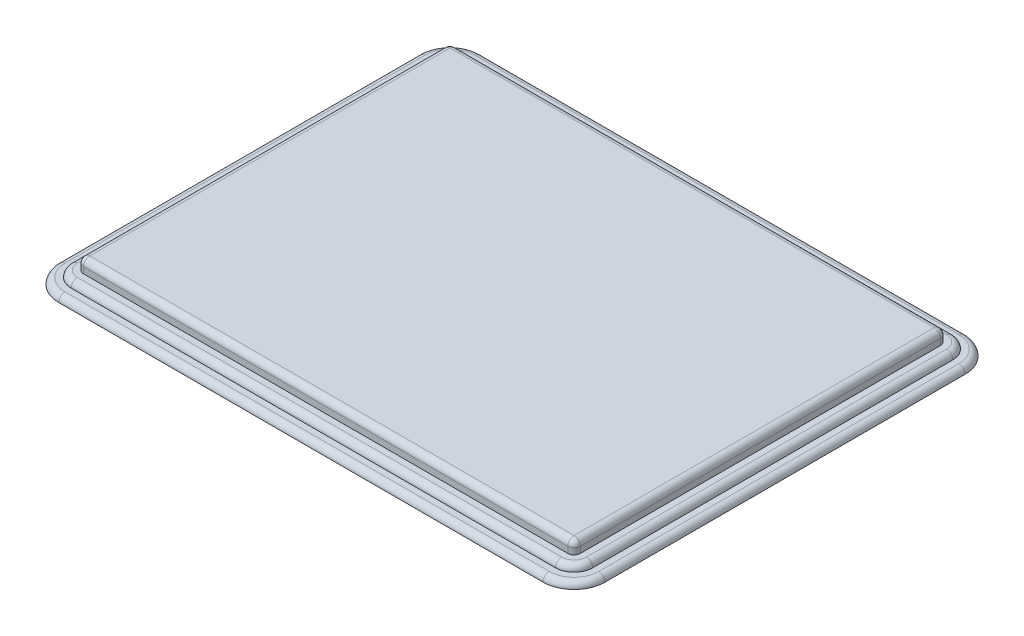
ISO-10303-21;
HEADER;
FILE_DESCRIPTION(('STEP AP214'),'2;1');
FILE_NAME('part.step','',(''),(''),'','','');
FILE_SCHEMA(('AUTOMOTIVE_DESIGN { 1 0 10303 214 1 1 1 1 }'));
ENDSEC;
DATA;
#1=APPLICATION_CONTEXT('core data for automotive mechanical design processes');
#2=APPLICATION_PROTOCOL_DEFINITION('international standard','automotive_design',2000,#1);
#3=PRODUCT_CONTEXT('',#1,'mechanical');
#4=PRODUCT('Part','Part','',(#3));
#5=PRODUCT_RELATED_PRODUCT_CATEGORY('part','',(#4));
#6=PRODUCT_DEFINITION_FORMATION('','',#4);
#7=PRODUCT_DEFINITION_CONTEXT('part definition',#1,'design');
#8=PRODUCT_DEFINITION('design','',#6,#7);
#9=PRODUCT_DEFINITION_SHAPE('','',#8);
#10=(LENGTH_UNIT() NAMED_UNIT(*) SI_UNIT(.MILLI.,.METRE.));
#11=(NAMED_UNIT(*) PLANE_ANGLE_UNIT() SI_UNIT($,.RADIAN.));
#12=(NAMED_UNIT(*) SI_UNIT($,.STERADIAN.) SOLID_ANGLE_UNIT());
#13=UNCERTAINTY_MEASURE_WITH_UNIT(LENGTH_MEASURE(1.E-05),#10,'distance_accuracy_value','');
#14=(GEOMETRIC_REPRESENTATION_CONTEXT(3) GLOBAL_UNCERTAINTY_ASSIGNED_CONTEXT((#13)) GLOBAL_UNIT_ASSIGNED_CONTEXT((#10,
#11,#12)) REPRESENTATION_CONTEXT('',''));
#15=CARTESIAN_POINT('',(0.,0.,0.));
#16=DIRECTION('',(0.,0.,1.));
#17=DIRECTION('',(1.,0.,0.));
#18=AXIS2_PLACEMENT_3D('',#15,#16,#17);
#19=CARTESIAN_POINT('',(1950.,100.,-1450.));
#20=DIRECTION('',(0.,-1.,0.));
#21=DIRECTION('',(0.,0.,-1.));
#22=AXIS2_PLACEMENT_3D('',#19,#20,#21);
#23=CYLINDRICAL_SURFACE('',#22,50.);
#24=DIRECTION('',(0.,-1.,0.));
#25=VECTOR('',#24,1.);
#26=CARTESIAN_POINT('',(1950.,100.,-1500.));
#27=LINE('',#26,#25);
#28=CARTESIAN_POINT('',(1950.,50.,-1500.));
#29=VERTEX_POINT('',#28);
#30=CARTESIAN_POINT('',(1950.,0.,-1500.));
#31=VERTEX_POINT('',#30);
#32=EDGE_CURVE('E454',#29,#31,#27,.T.);
#33=ORIENTED_EDGE('',*,*,#32,.F.);
#34=CARTESIAN_POINT('',(1950.,50.,-1450.));
#35=DIRECTION('',(0.,-1.,0.));
#36=DIRECTION('',(0.,0.,-1.));
#37=AXIS2_PLACEMENT_3D('',#34,#35,#36);
#38=CIRCLE('',#37,50.);
#39=CARTESIAN_POINT('',(2000.,50.,-1450.));
#40=VERTEX_POINT('',#39);
#41=EDGE_CURVE('E322',#29,#40,#38,.T.);
#42=ORIENTED_EDGE('',*,*,#41,.T.);
#43=DIRECTION('',(0.,-1.,0.));
#44=VECTOR('',#43,1.);
#45=CARTESIAN_POINT('',(2000.,100.,-1450.));
#46=LINE('',#45,#44);
#47=CARTESIAN_POINT('',(2000.,0.,-1450.));
#48=VERTEX_POINT('',#47);
#49=EDGE_CURVE('E426',#40,#48,#46,.T.);
#50=ORIENTED_EDGE('',*,*,#49,.T.);
#51=CARTESIAN_POINT('',(1950.,0.,-1450.));
#52=DIRECTION('',(0.,1.,0.));
#53=DIRECTION('',(0.,0.,-1.));
#54=AXIS2_PLACEMENT_3D('',#51,#52,#53);
#55=CIRCLE('',#54,50.);
#56=EDGE_CURVE('E393',#48,#31,#55,.T.);
#57=ORIENTED_EDGE('',*,*,#56,.T.);
#58=EDGE_LOOP('',(#33,#42,#50,#57));
#59=FACE_BOUND('',#58,.T.);
#60=ADVANCED_FACE('F41',(#59),#23,.T.);
#61=CARTESIAN_POINT('',(-1950.,100.,-1500.));
#62=DIRECTION('',(0.,0.,1.));
#63=DIRECTION('',(1.,0.,0.));
#64=AXIS2_PLACEMENT_3D('',#61,#62,#63);
#65=PLANE('',#64);
#66=DIRECTION('',(0.,-1.,0.));
#67=VECTOR('',#66,1.);
#68=CARTESIAN_POINT('',(-1950.,100.,-1500.));
#69=LINE('',#68,#67);
#70=CARTESIAN_POINT('',(-1950.,50.,-1500.));
#71=VERTEX_POINT('',#70);
#72=CARTESIAN_POINT('',(-1950.,0.,-1500.));
#73=VERTEX_POINT('',#72);
#74=EDGE_CURVE('E450',#71,#73,#69,.T.);
#75=ORIENTED_EDGE('',*,*,#74,.F.);
#76=DIRECTION('',(-1.,0.,0.));
#77=VECTOR('',#76,1.);
#78=CARTESIAN_POINT('',(-1950.,50.,-1500.));
#79=LINE('',#78,#77);
#80=EDGE_CURVE('E490',#71,#29,#79,.F.);
#81=ORIENTED_EDGE('',*,*,#80,.T.);
#82=ORIENTED_EDGE('',*,*,#32,.T.);
#83=DIRECTION('',(-1.,0.,0.));
#84=VECTOR('',#83,1.);
#85=CARTESIAN_POINT('',(-1950.,0.,-1500.));
#86=LINE('',#85,#84);
#87=EDGE_CURVE('E397',#31,#73,#86,.T.);
#88=ORIENTED_EDGE('',*,*,#87,.T.);
#89=EDGE_LOOP('',(#75,#81,#82,#88));
#90=FACE_BOUND('',#89,.T.);
#91=ADVANCED_FACE('F579',(#90),#65,.F.);
#92=CARTESIAN_POINT('',(-1950.,100.,-1450.));
#93=DIRECTION('',(0.,-1.,0.));
#94=DIRECTION('',(0.,0.,-1.));
#95=AXIS2_PLACEMENT_3D('',#92,#93,#94);
#96=CYLINDRICAL_SURFACE('',#95,50.);
#97=DIRECTION('',(0.,-1.,0.));
#98=VECTOR('',#97,1.);
#99=CARTESIAN_POINT('',(-2000.,100.,-1450.));
#100=LINE('',#99,#98);
#101=CARTESIAN_POINT('',(-2000.,50.,-1450.));
#102=VERTEX_POINT('',#101);
#103=CARTESIAN_POINT('',(-2000.,0.,-1450.));
#104=VERTEX_POINT('',#103);
#105=EDGE_CURVE('E446',#102,#104,#100,.T.);
#106=ORIENTED_EDGE('',*,*,#105,.F.);
#107=CARTESIAN_POINT('',(-1950.,50.,-1450.));
#108=DIRECTION('',(0.,-1.,0.));
#109=DIRECTION('',(0.,0.,-1.));
#110=AXIS2_PLACEMENT_3D('',#107,#108,#109);
#111=CIRCLE('',#110,50.);
#112=EDGE_CURVE('E487',#102,#71,#111,.T.);
#113=ORIENTED_EDGE('',*,*,#112,.T.);
#114=ORIENTED_EDGE('',*,*,#74,.T.);
#115=CARTESIAN_POINT('',(-1950.,0.,-1450.));
#116=DIRECTION('',(0.,1.,0.));
#117=DIRECTION('',(0.,0.,1.));
#118=AXIS2_PLACEMENT_3D('',#115,#116,#117);
#119=CIRCLE('',#118,50.);
#120=EDGE_CURVE('E402',#73,#104,#119,.T.);
#121=ORIENTED_EDGE('',*,*,#120,.T.);
#122=EDGE_LOOP('',(#106,#113,#114,#121));
#123=FACE_BOUND('',#122,.T.);
#124=ADVANCED_FACE('F538',(#123),#96,.T.);
#125=CARTESIAN_POINT('',(-2000.,100.,-1450.));
#126=DIRECTION('',(1.,0.,0.));
#127=DIRECTION('',(0.,0.,-1.));
#128=AXIS2_PLACEMENT_3D('',#125,#126,#127);
#129=PLANE('',#128);
#130=DIRECTION('',(0.,-1.,0.));
#131=VECTOR('',#130,1.);
#132=CARTESIAN_POINT('',(-2000.,100.,1450.));
#133=LINE('',#132,#131);
#134=CARTESIAN_POINT('',(-2000.,50.,1450.));
#135=VERTEX_POINT('',#134);
#136=CARTESIAN_POINT('',(-2000.,0.,1450.));
#137=VERTEX_POINT('',#136);
#138=EDGE_CURVE('E442',#135,#137,#133,.T.);
#139=ORIENTED_EDGE('',*,*,#138,.F.);
#140=DIRECTION('',(0.,0.,1.));
#141=VECTOR('',#140,1.);
#142=CARTESIAN_POINT('',(-2000.,50.,-1450.));
#143=LINE('',#142,#141);
#144=EDGE_CURVE('E484',#135,#102,#143,.F.);
#145=ORIENTED_EDGE('',*,*,#144,.T.);
#146=ORIENTED_EDGE('',*,*,#105,.T.);
#147=DIRECTION('',(0.,0.,1.));
#148=VECTOR('',#147,1.);
#149=CARTESIAN_POINT('',(-2000.,0.,-1450.));
#150=LINE('',#149,#148);
#151=EDGE_CURVE('E406',#104,#137,#150,.T.);
#152=ORIENTED_EDGE('',*,*,#151,.T.);
#153=EDGE_LOOP('',(#139,#145,#146,#152));
#154=FACE_BOUND('',#153,.T.);
#155=ADVANCED_FACE('F536',(#154),#129,.F.);
#156=CARTESIAN_POINT('',(-1950.,100.,1450.));
#157=DIRECTION('',(0.,-1.,0.));
#158=DIRECTION('',(0.,0.,-1.));
#159=AXIS2_PLACEMENT_3D('',#156,#157,#158);
#160=CYLINDRICAL_SURFACE('',#159,50.);
#161=DIRECTION('',(0.,-1.,0.));
#162=VECTOR('',#161,1.);
#163=CARTESIAN_POINT('',(-1950.,100.,1500.));
#164=LINE('',#163,#162);
#165=CARTESIAN_POINT('',(-1950.,50.,1500.));
#166=VERTEX_POINT('',#165);
#167=CARTESIAN_POINT('',(-1950.,0.,1500.));
#168=VERTEX_POINT('',#167);
#169=EDGE_CURVE('E438',#166,#168,#164,.T.);
#170=ORIENTED_EDGE('',*,*,#169,.F.);
#171=CARTESIAN_POINT('',(-1950.,50.,1450.));
#172=DIRECTION('',(0.,-1.,0.));
#173=DIRECTION('',(0.,0.,-1.));
#174=AXIS2_PLACEMENT_3D('',#171,#172,#173);
#175=CIRCLE('',#174,50.);
#176=EDGE_CURVE('E481',#166,#135,#175,.T.);
#177=ORIENTED_EDGE('',*,*,#176,.T.);
#178=ORIENTED_EDGE('',*,*,#138,.T.);
#179=CARTESIAN_POINT('',(-1950.,0.,1450.));
#180=DIRECTION('',(0.,1.,0.));
#181=DIRECTION('',(0.,0.,1.));
#182=AXIS2_PLACEMENT_3D('',#179,#180,#181);
#183=CIRCLE('',#182,50.);
#184=EDGE_CURVE('E410',#137,#168,#183,.T.);
#185=ORIENTED_EDGE('',*,*,#184,.T.);
#186=EDGE_LOOP('',(#170,#177,#178,#185));
#187=FACE_BOUND('',#186,.T.);
#188=ADVANCED_FACE('F542',(#187),#160,.T.);
#189=CARTESIAN_POINT('',(-1950.,100.,1500.));
#190=DIRECTION('',(0.,0.,-1.));
#191=DIRECTION('',(-1.,0.,0.));
#192=AXIS2_PLACEMENT_3D('',#189,#190,#191);
#193=PLANE('',#192);
#194=DIRECTION('',(0.,-1.,0.));
#195=VECTOR('',#194,1.);
#196=CARTESIAN_POINT('',(1950.,100.,1500.));
#197=LINE('',#196,#195);
#198=CARTESIAN_POINT('',(1950.,50.,1500.));
#199=VERTEX_POINT('',#198);
#200=CARTESIAN_POINT('',(1950.,0.,1500.));
#201=VERTEX_POINT('',#200);
#202=EDGE_CURVE('E434',#199,#201,#197,.T.);
#203=ORIENTED_EDGE('',*,*,#202,.F.);
#204=DIRECTION('',(1.,0.,0.));
#205=VECTOR('',#204,1.);
#206=CARTESIAN_POINT('',(-1950.,50.,1500.));
#207=LINE('',#206,#205);
#208=EDGE_CURVE('E478',#199,#166,#207,.F.);
#209=ORIENTED_EDGE('',*,*,#208,.T.);
#210=ORIENTED_EDGE('',*,*,#169,.T.);
#211=DIRECTION('',(1.,0.,0.));
#212=VECTOR('',#211,1.);
#213=CARTESIAN_POINT('',(-1950.,0.,1500.));
#214=LINE('',#213,#212);
#215=EDGE_CURVE('E414',#168,#201,#214,.T.);
#216=ORIENTED_EDGE('',*,*,#215,.T.);
#217=EDGE_LOOP('',(#203,#209,#210,#216));
#218=FACE_BOUND('',#217,.T.);
#219=ADVANCED_FACE('F545',(#218),#193,.F.);
#220=CARTESIAN_POINT('',(1950.,100.,1450.));
#221=DIRECTION('',(0.,-1.,0.));
#222=DIRECTION('',(0.,0.,-1.));
#223=AXIS2_PLACEMENT_3D('',#220,#221,#222);
#224=CYLINDRICAL_SURFACE('',#223,50.);
#225=DIRECTION('',(0.,-1.,0.));
#226=VECTOR('',#225,1.);
#227=CARTESIAN_POINT('',(2000.,100.,1450.));
#228=LINE('',#227,#226);
#229=CARTESIAN_POINT('',(2000.,50.,1450.));
#230=VERTEX_POINT('',#229);
#231=CARTESIAN_POINT('',(2000.,0.,1450.));
#232=VERTEX_POINT('',#231);
#233=EDGE_CURVE('E430',#230,#232,#228,.T.);
#234=ORIENTED_EDGE('',*,*,#233,.F.);
#235=CARTESIAN_POINT('',(1950.,50.,1450.));
#236=DIRECTION('',(0.,-1.,0.));
#237=DIRECTION('',(0.,0.,-1.));
#238=AXIS2_PLACEMENT_3D('',#235,#236,#237);
#239=CIRCLE('',#238,50.);
#240=EDGE_CURVE('E475',#230,#199,#239,.T.);
#241=ORIENTED_EDGE('',*,*,#240,.T.);
#242=ORIENTED_EDGE('',*,*,#202,.T.);
#243=CARTESIAN_POINT('',(1950.,0.,1450.));
#244=DIRECTION('',(0.,1.,0.));
#245=DIRECTION('',(0.,0.,1.));
#246=AXIS2_PLACEMENT_3D('',#243,#244,#245);
#247=CIRCLE('',#246,50.);
#248=EDGE_CURVE('E418',#201,#232,#247,.T.);
#249=ORIENTED_EDGE('',*,*,#248,.T.);
#250=EDGE_LOOP('',(#234,#241,#242,#249));
#251=FACE_BOUND('',#250,.T.);
#252=ADVANCED_FACE('F828',(#251),#224,.T.);
#253=CARTESIAN_POINT('',(2000.,100.,-1450.));
#254=DIRECTION('',(-1.,0.,0.));
#255=DIRECTION('',(0.,0.,1.));
#256=AXIS2_PLACEMENT_3D('',#253,#254,#255);
#257=PLANE('',#256);
#258=ORIENTED_EDGE('',*,*,#49,.F.);
#259=DIRECTION('',(0.,0.,-1.));
#260=VECTOR('',#259,1.);
#261=CARTESIAN_POINT('',(2000.,50.,-1450.));
#262=LINE('',#261,#260);
#263=EDGE_CURVE('E471',#40,#230,#262,.F.);
#264=ORIENTED_EDGE('',*,*,#263,.T.);
#265=ORIENTED_EDGE('',*,*,#233,.T.);
#266=DIRECTION('',(0.,0.,-1.));
#267=VECTOR('',#266,1.);
#268=CARTESIAN_POINT('',(2000.,0.,-1450.));
#269=LINE('',#268,#267);
#270=EDGE_CURVE('E422',#232,#48,#269,.T.);
#271=ORIENTED_EDGE('',*,*,#270,.T.);
#272=EDGE_LOOP('',(#258,#264,#265,#271));
#273=FACE_BOUND('',#272,.T.);
#274=ADVANCED_FACE('F821',(#273),#257,.F.);
#275=CARTESIAN_POINT('',(1950.,100.,-1450.));
#276=DIRECTION('',(0.,-1.,0.));
#277=DIRECTION('',(0.,0.,-1.));
#278=AXIS2_PLACEMENT_3D('',#275,#276,#277);
#279=PLANE('',#278);
#280=DIRECTION('',(1.,0.,0.));
#281=VECTOR('',#280,1.);
#282=CARTESIAN_POINT('',(1950.,100.,1450.));
#283=LINE('',#282,#281);
#284=CARTESIAN_POINT('',(-1950.,100.,1450.));
#285=VERTEX_POINT('',#284);
#286=CARTESIAN_POINT('',(1950.,100.,1450.));
#287=VERTEX_POINT('',#286);
#288=EDGE_CURVE('E464',#285,#287,#283,.T.);
#289=ORIENTED_EDGE('',*,*,#288,.T.);
#290=DIRECTION('',(0.,0.,-1.));
#291=VECTOR('',#290,1.);
#292=CARTESIAN_POINT('',(1950.,100.,-1450.));
#293=LINE('',#292,#291);
#294=CARTESIAN_POINT('',(1950.,100.,-1450.));
#295=VERTEX_POINT('',#294);
#296=EDGE_CURVE('E467',#287,#295,#293,.T.);
#297=ORIENTED_EDGE('',*,*,#296,.T.);
#298=DIRECTION('',(-1.,0.,0.));
#299=VECTOR('',#298,1.);
#300=CARTESIAN_POINT('',(1950.,100.,-1450.));
#301=LINE('',#300,#299);
#302=CARTESIAN_POINT('',(-1950.,100.,-1450.));
#303=VERTEX_POINT('',#302);
#304=EDGE_CURVE('E458',#295,#303,#301,.T.);
#305=ORIENTED_EDGE('',*,*,#304,.T.);
#306=DIRECTION('',(0.,0.,1.));
#307=VECTOR('',#306,1.);
#308=CARTESIAN_POINT('',(-1950.,100.,-1450.));
#309=LINE('',#308,#307);
#310=EDGE_CURVE('E461',#303,#285,#309,.T.);
#311=ORIENTED_EDGE('',*,*,#310,.T.);
#312=EDGE_LOOP('',(#289,#297,#305,#311));
#313=FACE_BOUND('',#312,.T.);
#314=ADVANCED_FACE('F560',(#313),#279,.F.);
#315=CARTESIAN_POINT('',(-1950.,50.,-1450.));
#316=DIRECTION('',(0.,0.,1.));
#317=DIRECTION('',(1.,0.,0.));
#318=AXIS2_PLACEMENT_3D('',#315,#316,#317);
#319=CYLINDRICAL_SURFACE('',#318,50.);
#320=CARTESIAN_POINT('',(-1950.,50.,-1450.));
#321=DIRECTION('',(0.,0.,-1.));
#322=DIRECTION('',(-1.,0.,0.));
#323=AXIS2_PLACEMENT_3D('',#320,#321,#322);
#324=CIRCLE('',#323,50.);
#325=EDGE_CURVE('E516',#102,#303,#324,.T.);
#326=ORIENTED_EDGE('',*,*,#325,.F.);
#327=ORIENTED_EDGE('',*,*,#144,.F.);
#328=CARTESIAN_POINT('',(-1950.,50.,1450.));
#329=DIRECTION('',(0.,0.,1.));
#330=DIRECTION('',(1.,0.,0.));
#331=AXIS2_PLACEMENT_3D('',#328,#329,#330);
#332=CIRCLE('',#331,50.);
#333=EDGE_CURVE('E398',#285,#135,#332,.T.);
#334=ORIENTED_EDGE('',*,*,#333,.F.);
#335=ORIENTED_EDGE('',*,*,#310,.F.);
#336=EDGE_LOOP('',(#326,#327,#334,#335));
#337=FACE_BOUND('',#336,.T.);
#338=ADVANCED_FACE('F531',(#337),#319,.T.);
#339=CARTESIAN_POINT('',(-1950.,50.,1450.));
#340=DIRECTION('',(0.,-1.,0.));
#341=DIRECTION('',(0.,0.,-1.));
#342=AXIS2_PLACEMENT_3D('',#339,#340,#341);
#343=SPHERICAL_SURFACE('',#342,50.);
#344=ORIENTED_EDGE('',*,*,#333,.T.);
#345=ORIENTED_EDGE('',*,*,#176,.F.);
#346=CARTESIAN_POINT('',(-1950.,50.,1450.));
#347=DIRECTION('',(1.,0.,0.));
#348=DIRECTION('',(0.,0.,-1.));
#349=AXIS2_PLACEMENT_3D('',#346,#347,#348);
#350=CIRCLE('',#349,50.);
#351=EDGE_CURVE('E512',#285,#166,#350,.T.);
#352=ORIENTED_EDGE('',*,*,#351,.F.);
#353=EDGE_LOOP('',(#344,#345,#352));
#354=FACE_BOUND('',#353,.T.);
#355=ADVANCED_FACE('F525',(#354),#343,.T.);
#356=CARTESIAN_POINT('',(-1950.,50.,-1450.));
#357=DIRECTION('',(0.,-1.,0.));
#358=DIRECTION('',(0.,0.,-1.));
#359=AXIS2_PLACEMENT_3D('',#356,#357,#358);
#360=SPHERICAL_SURFACE('',#359,50.);
#361=ORIENTED_EDGE('',*,*,#112,.F.);
#362=ORIENTED_EDGE('',*,*,#325,.T.);
#363=CARTESIAN_POINT('',(-1950.,50.,-1450.));
#364=DIRECTION('',(1.,0.,0.));
#365=DIRECTION('',(0.,0.,-1.));
#366=AXIS2_PLACEMENT_3D('',#363,#364,#365);
#367=CIRCLE('',#366,50.);
#368=EDGE_CURVE('E508',#71,#303,#367,.T.);
#369=ORIENTED_EDGE('',*,*,#368,.F.);
#370=EDGE_LOOP('',(#361,#362,#369));
#371=FACE_BOUND('',#370,.T.);
#372=ADVANCED_FACE('F569',(#371),#360,.T.);
#373=CARTESIAN_POINT('',(1950.,50.,1450.));
#374=DIRECTION('',(1.,0.,0.));
#375=DIRECTION('',(0.,0.,-1.));
#376=AXIS2_PLACEMENT_3D('',#373,#374,#375);
#377=CYLINDRICAL_SURFACE('',#376,50.);
#378=ORIENTED_EDGE('',*,*,#351,.T.);
#379=ORIENTED_EDGE('',*,*,#208,.F.);
#380=CARTESIAN_POINT('',(1950.,50.,1450.));
#381=DIRECTION('',(1.,0.,0.));
#382=DIRECTION('',(0.,0.,-1.));
#383=AXIS2_PLACEMENT_3D('',#380,#381,#382);
#384=CIRCLE('',#383,50.);
#385=EDGE_CURVE('E504',#287,#199,#384,.T.);
#386=ORIENTED_EDGE('',*,*,#385,.F.);
#387=ORIENTED_EDGE('',*,*,#288,.F.);
#388=EDGE_LOOP('',(#378,#379,#386,#387));
#389=FACE_BOUND('',#388,.T.);
#390=ADVANCED_FACE('F549',(#389),#377,.T.);
#391=CARTESIAN_POINT('',(1950.,50.,-1450.));
#392=DIRECTION('',(-1.,0.,0.));
#393=DIRECTION('',(0.,0.,1.));
#394=AXIS2_PLACEMENT_3D('',#391,#392,#393);
#395=CYLINDRICAL_SURFACE('',#394,50.);
#396=ORIENTED_EDGE('',*,*,#368,.T.);
#397=ORIENTED_EDGE('',*,*,#304,.F.);
#398=CARTESIAN_POINT('',(1950.,50.,-1450.));
#399=DIRECTION('',(1.,0.,0.));
#400=DIRECTION('',(0.,0.,-1.));
#401=AXIS2_PLACEMENT_3D('',#398,#399,#400);
#402=CIRCLE('',#401,50.);
#403=EDGE_CURVE('E500',#29,#295,#402,.T.);
#404=ORIENTED_EDGE('',*,*,#403,.F.);
#405=ORIENTED_EDGE('',*,*,#80,.F.);
#406=EDGE_LOOP('',(#396,#397,#404,#405));
#407=FACE_BOUND('',#406,.T.);
#408=ADVANCED_FACE('F564',(#407),#395,.T.);
#409=CARTESIAN_POINT('',(1950.,50.,1450.));
#410=DIRECTION('',(0.,-1.,0.));
#411=DIRECTION('',(0.,0.,-1.));
#412=AXIS2_PLACEMENT_3D('',#409,#410,#411);
#413=SPHERICAL_SURFACE('',#412,50.);
#414=ORIENTED_EDGE('',*,*,#385,.T.);
#415=ORIENTED_EDGE('',*,*,#240,.F.);
#416=CARTESIAN_POINT('',(1950.,50.,1450.));
#417=DIRECTION('',(0.,0.,-1.));
#418=DIRECTION('',(-1.,0.,0.));
#419=AXIS2_PLACEMENT_3D('',#416,#417,#418);
#420=CIRCLE('',#419,50.);
#421=EDGE_CURVE('E497',#287,#230,#420,.T.);
#422=ORIENTED_EDGE('',*,*,#421,.F.);
#423=EDGE_LOOP('',(#414,#415,#422));
#424=FACE_BOUND('',#423,.T.);
#425=ADVANCED_FACE('F553',(#424),#413,.T.);
#426=CARTESIAN_POINT('',(1950.,50.,-1450.));
#427=DIRECTION('',(0.,-1.,0.));
#428=DIRECTION('',(0.,0.,-1.));
#429=AXIS2_PLACEMENT_3D('',#426,#427,#428);
#430=SPHERICAL_SURFACE('',#429,50.);
#431=ORIENTED_EDGE('',*,*,#41,.F.);
#432=ORIENTED_EDGE('',*,*,#403,.T.);
#433=CARTESIAN_POINT('',(1950.,50.,-1450.));
#434=DIRECTION('',(0.,0.,1.));
#435=DIRECTION('',(1.,0.,0.));
#436=AXIS2_PLACEMENT_3D('',#433,#434,#435);
#437=CIRCLE('',#436,50.);
#438=EDGE_CURVE('E392',#40,#295,#437,.T.);
#439=ORIENTED_EDGE('',*,*,#438,.F.);
#440=EDGE_LOOP('',(#431,#432,#439));
#441=FACE_BOUND('',#440,.T.);
#442=ADVANCED_FACE('F592',(#441),#430,.T.);
#443=CARTESIAN_POINT('',(1950.,50.,-1450.));
#444=DIRECTION('',(0.,0.,-1.));
#445=DIRECTION('',(-1.,0.,0.));
#446=AXIS2_PLACEMENT_3D('',#443,#444,#445);
#447=CYLINDRICAL_SURFACE('',#446,50.);
#448=ORIENTED_EDGE('',*,*,#421,.T.);
#449=ORIENTED_EDGE('',*,*,#263,.F.);
#450=ORIENTED_EDGE('',*,*,#438,.T.);
#451=ORIENTED_EDGE('',*,*,#296,.F.);
#452=EDGE_LOOP('',(#448,#449,#450,#451));
#453=FACE_BOUND('',#452,.T.);
#454=ADVANCED_FACE('F557',(#453),#447,.T.);
#455=CARTESIAN_POINT('',(0.,0.,0.));
#456=DIRECTION('',(0.,-1.,0.));
#457=DIRECTION('',(0.,0.,-1.));
#458=AXIS2_PLACEMENT_3D('',#455,#456,#457);
#459=PLANE('',#458);
#460=DIRECTION('',(0.,0.,1.));
#461=VECTOR('',#460,1.);
#462=CARTESIAN_POINT('',(2050.,0.,0.));
#463=LINE('',#462,#461);
#464=CARTESIAN_POINT('',(2050.,0.,1450.));
#465=VERTEX_POINT('',#464);
#466=CARTESIAN_POINT('',(2050.,0.,-1450.));
#467=VERTEX_POINT('',#466);
#468=EDGE_CURVE('E341',#465,#467,#463,.F.);
#469=ORIENTED_EDGE('',*,*,#468,.T.);
#470=CARTESIAN_POINT('',(1950.,0.,-1450.));
#471=DIRECTION('',(0.,-1.,0.));
#472=DIRECTION('',(0.,0.,-1.));
#473=AXIS2_PLACEMENT_3D('',#470,#471,#472);
#474=CIRCLE('',#473,100.);
#475=CARTESIAN_POINT('',(1950.,0.,-1550.));
#476=VERTEX_POINT('',#475);
#477=EDGE_CURVE('E11',#467,#476,#474,.F.);
#478=ORIENTED_EDGE('',*,*,#477,.T.);
#479=DIRECTION('',(1.,0.,0.));
#480=VECTOR('',#479,1.);
#481=CARTESIAN_POINT('',(0.,0.,-1550.));
#482=LINE('',#481,#480);
#483=CARTESIAN_POINT('',(-1950.,0.,-1550.));
#484=VERTEX_POINT('',#483);
#485=EDGE_CURVE('E51',#476,#484,#482,.F.);
#486=ORIENTED_EDGE('',*,*,#485,.T.);
#487=CARTESIAN_POINT('',(-1950.,0.,-1450.));
#488=DIRECTION('',(0.,-1.,0.));
#489=DIRECTION('',(0.,0.,-1.));
#490=AXIS2_PLACEMENT_3D('',#487,#488,#489);
#491=CIRCLE('',#490,100.);
#492=CARTESIAN_POINT('',(-2050.,0.,-1450.));
#493=VERTEX_POINT('',#492);
#494=EDGE_CURVE('E356',#484,#493,#491,.F.);
#495=ORIENTED_EDGE('',*,*,#494,.T.);
#496=DIRECTION('',(0.,0.,-1.));
#497=VECTOR('',#496,1.);
#498=CARTESIAN_POINT('',(-2050.,0.,0.));
#499=LINE('',#498,#497);
#500=CARTESIAN_POINT('',(-2050.,0.,1450.));
#501=VERTEX_POINT('',#500);
#502=EDGE_CURVE('E353',#493,#501,#499,.F.);
#503=ORIENTED_EDGE('',*,*,#502,.T.);
#504=CARTESIAN_POINT('',(-1950.,0.,1450.));
#505=DIRECTION('',(0.,-1.,0.));
#506=DIRECTION('',(0.,0.,-1.));
#507=AXIS2_PLACEMENT_3D('',#504,#505,#506);
#508=CIRCLE('',#507,100.);
#509=CARTESIAN_POINT('',(-1950.,0.,1550.));
#510=VERTEX_POINT('',#509);
#511=EDGE_CURVE('E350',#501,#510,#508,.F.);
#512=ORIENTED_EDGE('',*,*,#511,.T.);
#513=DIRECTION('',(-1.,0.,0.));
#514=VECTOR('',#513,1.);
#515=CARTESIAN_POINT('',(0.,0.,1550.));
#516=LINE('',#515,#514);
#517=CARTESIAN_POINT('',(1950.,0.,1550.));
#518=VERTEX_POINT('',#517);
#519=EDGE_CURVE('E347',#510,#518,#516,.F.);
#520=ORIENTED_EDGE('',*,*,#519,.T.);
#521=CARTESIAN_POINT('',(1950.,0.,1450.));
#522=DIRECTION('',(0.,-1.,0.));
#523=DIRECTION('',(0.,0.,-1.));
#524=AXIS2_PLACEMENT_3D('',#521,#522,#523);
#525=CIRCLE('',#524,100.);
#526=EDGE_CURVE('E344',#518,#465,#525,.F.);
#527=ORIENTED_EDGE('',*,*,#526,.T.);
#528=EDGE_LOOP('',(#469,#478,#486,#495,#503,#512,#520,#527));
#529=FACE_BOUND('',#528,.T.);
#530=ORIENTED_EDGE('',*,*,#56,.F.);
#531=ORIENTED_EDGE('',*,*,#270,.F.);
#532=ORIENTED_EDGE('',*,*,#248,.F.);
#533=ORIENTED_EDGE('',*,*,#215,.F.);
#534=ORIENTED_EDGE('',*,*,#184,.F.);
#535=ORIENTED_EDGE('',*,*,#151,.F.);
#536=ORIENTED_EDGE('',*,*,#120,.F.);
#537=ORIENTED_EDGE('',*,*,#87,.F.);
#538=EDGE_LOOP('',(#530,#531,#532,#533,#534,#535,#536,#537));
#539=FACE_BOUND('',#538,.T.);
#540=ADVANCED_FACE('F359',(#529,#539),#459,.F.);
#541=CARTESIAN_POINT('',(0.,-100.,0.));
#542=DIRECTION('',(0.,-1.,0.));
#543=DIRECTION('',(0.,0.,-1.));
#544=AXIS2_PLACEMENT_3D('',#541,#542,#543);
#545=PLANE('',#544);
#546=DIRECTION('',(-1.,0.,0.));
#547=VECTOR('',#546,1.);
#548=CARTESIAN_POINT('',(0.,-100.,1700.));
#549=LINE('',#548,#547);
#550=CARTESIAN_POINT('',(1950.,-100.,1700.));
#551=VERTEX_POINT('',#550);
#552=CARTESIAN_POINT('',(-1950.,-100.,1700.));
#553=VERTEX_POINT('',#552);
#554=EDGE_CURVE('E216',#551,#553,#549,.T.);
#555=ORIENTED_EDGE('',*,*,#554,.T.);
#556=CARTESIAN_POINT('',(-1950.,-100.,1450.));
#557=DIRECTION('',(0.,-1.,0.));
#558=DIRECTION('',(0.,0.,-1.));
#559=AXIS2_PLACEMENT_3D('',#556,#557,#558);
#560=CIRCLE('',#559,250.);
#561=CARTESIAN_POINT('',(-2200.,-100.,1450.));
#562=VERTEX_POINT('',#561);
#563=EDGE_CURVE('E219',#553,#562,#560,.T.);
#564=ORIENTED_EDGE('',*,*,#563,.T.);
#565=DIRECTION('',(0.,0.,-1.));
#566=VECTOR('',#565,1.);
#567=CARTESIAN_POINT('',(-2200.,-100.,0.));
#568=LINE('',#567,#566);
#569=CARTESIAN_POINT('',(-2200.,-100.,-1450.));
#570=VERTEX_POINT('',#569);
#571=EDGE_CURVE('E239',#562,#570,#568,.T.);
#572=ORIENTED_EDGE('',*,*,#571,.T.);
#573=CARTESIAN_POINT('',(-1950.,-100.,-1450.));
#574=DIRECTION('',(0.,-1.,0.));
#575=DIRECTION('',(0.,0.,-1.));
#576=AXIS2_PLACEMENT_3D('',#573,#574,#575);
#577=CIRCLE('',#576,250.);
#578=CARTESIAN_POINT('',(-1950.,-100.,-1700.));
#579=VERTEX_POINT('',#578);
#580=EDGE_CURVE('E912',#570,#579,#577,.T.);
#581=ORIENTED_EDGE('',*,*,#580,.T.);
#582=DIRECTION('',(1.,0.,0.));
#583=VECTOR('',#582,1.);
#584=CARTESIAN_POINT('',(0.,-100.,-1700.));
#585=LINE('',#584,#583);
#586=CARTESIAN_POINT('',(1950.,-100.,-1700.));
#587=VERTEX_POINT('',#586);
#588=EDGE_CURVE('E909',#579,#587,#585,.T.);
#589=ORIENTED_EDGE('',*,*,#588,.T.);
#590=CARTESIAN_POINT('',(1950.,-100.,-1450.));
#591=DIRECTION('',(0.,-1.,0.));
#592=DIRECTION('',(0.,0.,-1.));
#593=AXIS2_PLACEMENT_3D('',#590,#591,#592);
#594=CIRCLE('',#593,250.);
#595=CARTESIAN_POINT('',(2200.,-100.,-1450.));
#596=VERTEX_POINT('',#595);
#597=EDGE_CURVE('E905',#587,#596,#594,.T.);
#598=ORIENTED_EDGE('',*,*,#597,.T.);
#599=DIRECTION('',(0.,0.,1.));
#600=VECTOR('',#599,1.);
#601=CARTESIAN_POINT('',(2200.,-100.,0.));
#602=LINE('',#601,#600);
#603=CARTESIAN_POINT('',(2200.,-100.,1450.));
#604=VERTEX_POINT('',#603);
#605=EDGE_CURVE('E900',#596,#604,#602,.T.);
#606=ORIENTED_EDGE('',*,*,#605,.T.);
#607=CARTESIAN_POINT('',(1950.,-100.,1450.));
#608=DIRECTION('',(0.,-1.,0.));
#609=DIRECTION('',(0.,0.,-1.));
#610=AXIS2_PLACEMENT_3D('',#607,#608,#609);
#611=CIRCLE('',#610,250.);
#612=EDGE_CURVE('E222',#604,#551,#611,.T.);
#613=ORIENTED_EDGE('',*,*,#612,.T.);
#614=EDGE_LOOP('',(#555,#564,#572,#581,#589,#598,#606,#613));
#615=FACE_BOUND('',#614,.T.);
#616=ADVANCED_FACE('F218',(#615),#545,.T.);
#617=CARTESIAN_POINT('',(0.,-50.,0.));
#618=DIRECTION('',(0.,-1.,0.));
#619=DIRECTION('',(0.,0.,-1.));
#620=AXIS2_PLACEMENT_3D('',#617,#618,#619);
#621=PLANE('',#620);
#622=DIRECTION('',(0.,0.,1.));
#623=VECTOR('',#622,1.);
#624=CARTESIAN_POINT('',(2150.,-50.,0.));
#625=LINE('',#624,#623);
#626=CARTESIAN_POINT('',(2150.,-50.,1450.));
#627=VERTEX_POINT('',#626);
#628=CARTESIAN_POINT('',(2150.,-50.,-1450.));
#629=VERTEX_POINT('',#628);
#630=EDGE_CURVE('E316',#627,#629,#625,.F.);
#631=ORIENTED_EDGE('',*,*,#630,.T.);
#632=CARTESIAN_POINT('',(1950.,-50.,-1450.));
#633=DIRECTION('',(0.,-1.,0.));
#634=DIRECTION('',(0.,0.,-1.));
#635=AXIS2_PLACEMENT_3D('',#632,#633,#634);
#636=CIRCLE('',#635,200.);
#637=CARTESIAN_POINT('',(1950.,-50.,-1650.));
#638=VERTEX_POINT('',#637);
#639=EDGE_CURVE('E337',#629,#638,#636,.F.);
#640=ORIENTED_EDGE('',*,*,#639,.T.);
#641=DIRECTION('',(1.,0.,0.));
#642=VECTOR('',#641,1.);
#643=CARTESIAN_POINT('',(0.,-50.,-1650.));
#644=LINE('',#643,#642);
#645=CARTESIAN_POINT('',(-1950.,-50.,-1650.));
#646=VERTEX_POINT('',#645);
#647=EDGE_CURVE('E334',#638,#646,#644,.F.);
#648=ORIENTED_EDGE('',*,*,#647,.T.);
#649=CARTESIAN_POINT('',(-1950.,-50.,-1450.));
#650=DIRECTION('',(0.,-1.,0.));
#651=DIRECTION('',(0.,0.,-1.));
#652=AXIS2_PLACEMENT_3D('',#649,#650,#651);
#653=CIRCLE('',#652,200.);
#654=CARTESIAN_POINT('',(-2150.,-50.,-1450.));
#655=VERTEX_POINT('',#654);
#656=EDGE_CURVE('E331',#646,#655,#653,.F.);
#657=ORIENTED_EDGE('',*,*,#656,.T.);
#658=DIRECTION('',(0.,0.,-1.));
#659=VECTOR('',#658,1.);
#660=CARTESIAN_POINT('',(-2150.,-50.,0.));
#661=LINE('',#660,#659);
#662=CARTESIAN_POINT('',(-2150.,-50.,1450.));
#663=VERTEX_POINT('',#662);
#664=EDGE_CURVE('E328',#655,#663,#661,.F.);
#665=ORIENTED_EDGE('',*,*,#664,.T.);
#666=CARTESIAN_POINT('',(-1950.,-50.,1450.));
#667=DIRECTION('',(0.,-1.,0.));
#668=DIRECTION('',(0.,0.,-1.));
#669=AXIS2_PLACEMENT_3D('',#666,#667,#668);
#670=CIRCLE('',#669,200.);
#671=CARTESIAN_POINT('',(-1950.,-50.,1650.));
#672=VERTEX_POINT('',#671);
#673=EDGE_CURVE('E320',#663,#672,#670,.F.);
#674=ORIENTED_EDGE('',*,*,#673,.T.);
#675=DIRECTION('',(-1.,0.,0.));
#676=VECTOR('',#675,1.);
#677=CARTESIAN_POINT('',(0.,-50.,1650.));
#678=LINE('',#677,#676);
#679=CARTESIAN_POINT('',(1950.,-50.,1650.));
#680=VERTEX_POINT('',#679);
#681=EDGE_CURVE('E242',#672,#680,#678,.F.);
#682=ORIENTED_EDGE('',*,*,#681,.T.);
#683=CARTESIAN_POINT('',(1950.,-50.,1450.));
#684=DIRECTION('',(0.,-1.,0.));
#685=DIRECTION('',(0.,0.,-1.));
#686=AXIS2_PLACEMENT_3D('',#683,#684,#685);
#687=CIRCLE('',#686,200.);
#688=EDGE_CURVE('E312',#680,#627,#687,.F.);
#689=ORIENTED_EDGE('',*,*,#688,.T.);
#690=EDGE_LOOP('',(#631,#640,#648,#657,#665,#674,#682,#689));
#691=FACE_BOUND('',#690,.T.);
#692=CARTESIAN_POINT('',(1950.,-50.,1450.));
#693=DIRECTION('',(0.,-1.,0.));
#694=DIRECTION('',(0.,0.,-1.));
#695=AXIS2_PLACEMENT_3D('',#692,#693,#694);
#696=CIRCLE('',#695,150.);
#697=CARTESIAN_POINT('',(2100.,-50.,1450.));
#698=VERTEX_POINT('',#697);
#699=CARTESIAN_POINT('',(1950.,-50.,1600.));
#700=VERTEX_POINT('',#699);
#701=EDGE_CURVE('E389',#698,#700,#696,.T.);
#702=ORIENTED_EDGE('',*,*,#701,.T.);
#703=DIRECTION('',(-1.,0.,0.));
#704=VECTOR('',#703,1.);
#705=CARTESIAN_POINT('',(0.,-50.,1600.));
#706=LINE('',#705,#704);
#707=CARTESIAN_POINT('',(-1950.,-50.,1600.));
#708=VERTEX_POINT('',#707);
#709=EDGE_CURVE('E894',#700,#708,#706,.T.);
#710=ORIENTED_EDGE('',*,*,#709,.T.);
#711=CARTESIAN_POINT('',(-1950.,-50.,1450.));
#712=DIRECTION('',(0.,-1.,0.));
#713=DIRECTION('',(0.,0.,-1.));
#714=AXIS2_PLACEMENT_3D('',#711,#712,#713);
#715=CIRCLE('',#714,150.);
#716=CARTESIAN_POINT('',(-2100.,-50.,1450.));
#717=VERTEX_POINT('',#716);
#718=EDGE_CURVE('E379',#708,#717,#715,.T.);
#719=ORIENTED_EDGE('',*,*,#718,.T.);
#720=DIRECTION('',(0.,0.,-1.));
#721=VECTOR('',#720,1.);
#722=CARTESIAN_POINT('',(-2100.,-50.,0.));
#723=LINE('',#722,#721);
#724=CARTESIAN_POINT('',(-2100.,-50.,-1450.));
#725=VERTEX_POINT('',#724);
#726=EDGE_CURVE('E373',#717,#725,#723,.T.);
#727=ORIENTED_EDGE('',*,*,#726,.T.);
#728=CARTESIAN_POINT('',(-1950.,-50.,-1450.));
#729=DIRECTION('',(0.,-1.,0.));
#730=DIRECTION('',(0.,0.,-1.));
#731=AXIS2_PLACEMENT_3D('',#728,#729,#730);
#732=CIRCLE('',#731,150.);
#733=CARTESIAN_POINT('',(-1950.,-50.,-1600.));
#734=VERTEX_POINT('',#733);
#735=EDGE_CURVE('E368',#725,#734,#732,.T.);
#736=ORIENTED_EDGE('',*,*,#735,.T.);
#737=DIRECTION('',(1.,0.,0.));
#738=VECTOR('',#737,1.);
#739=CARTESIAN_POINT('',(0.,-50.,-1600.));
#740=LINE('',#739,#738);
#741=CARTESIAN_POINT('',(1950.,-50.,-1600.));
#742=VERTEX_POINT('',#741);
#743=EDGE_CURVE('E372',#734,#742,#740,.T.);
#744=ORIENTED_EDGE('',*,*,#743,.T.);
#745=CARTESIAN_POINT('',(1950.,-50.,-1450.));
#746=DIRECTION('',(0.,-1.,0.));
#747=DIRECTION('',(0.,0.,-1.));
#748=AXIS2_PLACEMENT_3D('',#745,#746,#747);
#749=CIRCLE('',#748,150.);
#750=CARTESIAN_POINT('',(2100.,-50.,-1450.));
#751=VERTEX_POINT('',#750);
#752=EDGE_CURVE('E377',#742,#751,#749,.T.);
#753=ORIENTED_EDGE('',*,*,#752,.T.);
#754=DIRECTION('',(0.,0.,1.));
#755=VECTOR('',#754,1.);
#756=CARTESIAN_POINT('',(2100.,-50.,0.));
#757=LINE('',#756,#755);
#758=EDGE_CURVE('E386',#751,#698,#757,.T.);
#759=ORIENTED_EDGE('',*,*,#758,.T.);
#760=EDGE_LOOP('',(#702,#710,#719,#727,#736,#744,#753,#759));
#761=FACE_BOUND('',#760,.T.);
#762=ADVANCED_FACE('F628',(#691,#761),#621,.F.);
#763=CARTESIAN_POINT('',(-1950.,-100.,1450.));
#764=DIRECTION('',(0.,-1.,0.));
#765=DIRECTION('',(0.,0.,-1.));
#766=AXIS2_PLACEMENT_3D('',#763,#764,#765);
#767=TOROIDAL_SURFACE('',#766,200.,50.);
#768=CARTESIAN_POINT('',(-1950.,-100.,1650.));
#769=DIRECTION('',(1.,0.,0.));
#770=DIRECTION('',(0.,0.,-1.));
#771=AXIS2_PLACEMENT_3D('',#768,#769,#770);
#772=CIRCLE('',#771,50.);
#773=EDGE_CURVE('E234',#672,#553,#772,.T.);
#774=ORIENTED_EDGE('',*,*,#773,.F.);
#775=ORIENTED_EDGE('',*,*,#673,.F.);
#776=CARTESIAN_POINT('',(-2150.,-100.,1450.));
#777=DIRECTION('',(0.,0.,-1.));
#778=DIRECTION('',(-1.,0.,0.));
#779=AXIS2_PLACEMENT_3D('',#776,#777,#778);
#780=CIRCLE('',#779,50.);
#781=EDGE_CURVE('E228',#562,#663,#780,.T.);
#782=ORIENTED_EDGE('',*,*,#781,.F.);
#783=ORIENTED_EDGE('',*,*,#563,.F.);
#784=EDGE_LOOP('',(#774,#775,#782,#783));
#785=FACE_BOUND('',#784,.T.);
#786=ADVANCED_FACE('F232',(#785),#767,.T.);
#787=CARTESIAN_POINT('',(-2150.,-100.,0.));
#788=DIRECTION('',(0.,0.,-1.));
#789=DIRECTION('',(-1.,0.,0.));
#790=AXIS2_PLACEMENT_3D('',#787,#788,#789);
#791=CYLINDRICAL_SURFACE('',#790,50.);
#792=ORIENTED_EDGE('',*,*,#781,.T.);
#793=ORIENTED_EDGE('',*,*,#664,.F.);
#794=CARTESIAN_POINT('',(-2150.,-100.,-1450.));
#795=DIRECTION('',(0.,0.,-1.));
#796=DIRECTION('',(-1.,0.,0.));
#797=AXIS2_PLACEMENT_3D('',#794,#795,#796);
#798=CIRCLE('',#797,50.);
#799=EDGE_CURVE('E244',#570,#655,#798,.T.);
#800=ORIENTED_EDGE('',*,*,#799,.F.);
#801=ORIENTED_EDGE('',*,*,#571,.F.);
#802=EDGE_LOOP('',(#792,#793,#800,#801));
#803=FACE_BOUND('',#802,.T.);
#804=ADVANCED_FACE('F641',(#803),#791,.T.);
#805=CARTESIAN_POINT('',(0.,-100.,1650.));
#806=DIRECTION('',(-1.,0.,0.));
#807=DIRECTION('',(0.,0.,1.));
#808=AXIS2_PLACEMENT_3D('',#805,#806,#807);
#809=CYLINDRICAL_SURFACE('',#808,50.);
#810=ORIENTED_EDGE('',*,*,#773,.T.);
#811=ORIENTED_EDGE('',*,*,#554,.F.);
#812=CARTESIAN_POINT('',(1950.,-100.,1650.));
#813=DIRECTION('',(1.,0.,0.));
#814=DIRECTION('',(0.,0.,-1.));
#815=AXIS2_PLACEMENT_3D('',#812,#813,#814);
#816=CIRCLE('',#815,50.);
#817=EDGE_CURVE('E250',#680,#551,#816,.T.);
#818=ORIENTED_EDGE('',*,*,#817,.F.);
#819=ORIENTED_EDGE('',*,*,#681,.F.);
#820=EDGE_LOOP('',(#810,#811,#818,#819));
#821=FACE_BOUND('',#820,.T.);
#822=ADVANCED_FACE('F241',(#821),#809,.T.);
#823=CARTESIAN_POINT('',(-1950.,-100.,-1450.));
#824=DIRECTION('',(0.,-1.,0.));
#825=DIRECTION('',(0.,0.,-1.));
#826=AXIS2_PLACEMENT_3D('',#823,#824,#825);
#827=TOROIDAL_SURFACE('',#826,200.,50.);
#828=ORIENTED_EDGE('',*,*,#799,.T.);
#829=ORIENTED_EDGE('',*,*,#656,.F.);
#830=CARTESIAN_POINT('',(-1950.,-100.,-1650.));
#831=DIRECTION('',(1.,0.,0.));
#832=DIRECTION('',(0.,1.,0.));
#833=AXIS2_PLACEMENT_3D('',#830,#831,#832);
#834=CIRCLE('',#833,50.);
#835=EDGE_CURVE('E304',#579,#646,#834,.T.);
#836=ORIENTED_EDGE('',*,*,#835,.F.);
#837=ORIENTED_EDGE('',*,*,#580,.F.);
#838=EDGE_LOOP('',(#828,#829,#836,#837));
#839=FACE_BOUND('',#838,.T.);
#840=ADVANCED_FACE('F655',(#839),#827,.T.);
#841=CARTESIAN_POINT('',(1950.,-100.,1450.));
#842=DIRECTION('',(0.,-1.,0.));
#843=DIRECTION('',(0.,0.,-1.));
#844=AXIS2_PLACEMENT_3D('',#841,#842,#843);
#845=TOROIDAL_SURFACE('',#844,200.,50.);
#846=ORIENTED_EDGE('',*,*,#817,.T.);
#847=ORIENTED_EDGE('',*,*,#612,.F.);
#848=CARTESIAN_POINT('',(2150.,-100.,1450.));
#849=DIRECTION('',(0.,0.,-1.));
#850=DIRECTION('',(-1.,0.,0.));
#851=AXIS2_PLACEMENT_3D('',#848,#849,#850);
#852=CIRCLE('',#851,50.);
#853=EDGE_CURVE('E297',#627,#604,#852,.T.);
#854=ORIENTED_EDGE('',*,*,#853,.F.);
#855=ORIENTED_EDGE('',*,*,#688,.F.);
#856=EDGE_LOOP('',(#846,#847,#854,#855));
#857=FACE_BOUND('',#856,.T.);
#858=ADVANCED_FACE('F310',(#857),#845,.T.);
#859=CARTESIAN_POINT('',(0.,-100.,-1650.));
#860=DIRECTION('',(1.,0.,0.));
#861=DIRECTION('',(0.,0.,-1.));
#862=AXIS2_PLACEMENT_3D('',#859,#860,#861);
#863=CYLINDRICAL_SURFACE('',#862,50.);
#864=ORIENTED_EDGE('',*,*,#835,.T.);
#865=ORIENTED_EDGE('',*,*,#647,.F.);
#866=CARTESIAN_POINT('',(1950.,-100.,-1650.));
#867=DIRECTION('',(1.,0.,0.));
#868=DIRECTION('',(0.,0.,-1.));
#869=AXIS2_PLACEMENT_3D('',#866,#867,#868);
#870=CIRCLE('',#869,50.);
#871=EDGE_CURVE('E289',#587,#638,#870,.T.);
#872=ORIENTED_EDGE('',*,*,#871,.F.);
#873=ORIENTED_EDGE('',*,*,#588,.F.);
#874=EDGE_LOOP('',(#864,#865,#872,#873));
#875=FACE_BOUND('',#874,.T.);
#876=ADVANCED_FACE('F669',(#875),#863,.T.);
#877=CARTESIAN_POINT('',(2150.,-100.,0.));
#878=DIRECTION('',(0.,0.,1.));
#879=DIRECTION('',(1.,0.,0.));
#880=AXIS2_PLACEMENT_3D('',#877,#878,#879);
#881=CYLINDRICAL_SURFACE('',#880,50.);
#882=ORIENTED_EDGE('',*,*,#853,.T.);
#883=ORIENTED_EDGE('',*,*,#605,.F.);
#884=CARTESIAN_POINT('',(2150.,-100.,-1450.));
#885=DIRECTION('',(0.,0.,-1.));
#886=DIRECTION('',(-1.,0.,0.));
#887=AXIS2_PLACEMENT_3D('',#884,#885,#886);
#888=CIRCLE('',#887,50.);
#889=EDGE_CURVE('E283',#629,#596,#888,.T.);
#890=ORIENTED_EDGE('',*,*,#889,.F.);
#891=ORIENTED_EDGE('',*,*,#630,.F.);
#892=EDGE_LOOP('',(#882,#883,#890,#891));
#893=FACE_BOUND('',#892,.T.);
#894=ADVANCED_FACE('F676',(#893),#881,.T.);
#895=CARTESIAN_POINT('',(1950.,-100.,-1450.));
#896=DIRECTION('',(0.,-1.,0.));
#897=DIRECTION('',(0.,0.,-1.));
#898=AXIS2_PLACEMENT_3D('',#895,#896,#897);
#899=TOROIDAL_SURFACE('',#898,200.,50.);
#900=ORIENTED_EDGE('',*,*,#871,.T.);
#901=ORIENTED_EDGE('',*,*,#639,.F.);
#902=ORIENTED_EDGE('',*,*,#889,.T.);
#903=ORIENTED_EDGE('',*,*,#597,.F.);
#904=EDGE_LOOP('',(#900,#901,#902,#903));
#905=FACE_BOUND('',#904,.T.);
#906=ADVANCED_FACE('F684',(#905),#899,.T.);
#907=CARTESIAN_POINT('',(-1950.,-50.,1450.));
#908=DIRECTION('',(0.,-1.,0.));
#909=DIRECTION('',(0.,0.,-1.));
#910=AXIS2_PLACEMENT_3D('',#907,#908,#909);
#911=TOROIDAL_SURFACE('',#910,100.,50.);
#912=CARTESIAN_POINT('',(-1950.,-50.,1550.));
#913=DIRECTION('',(1.,0.,0.));
#914=DIRECTION('',(0.,0.,-1.));
#915=AXIS2_PLACEMENT_3D('',#912,#913,#914);
#916=CIRCLE('',#915,50.);
#917=EDGE_CURVE('E274',#510,#708,#916,.T.);
#918=ORIENTED_EDGE('',*,*,#917,.F.);
#919=ORIENTED_EDGE('',*,*,#511,.F.);
#920=CARTESIAN_POINT('',(-2050.,-50.,1450.));
#921=DIRECTION('',(0.,0.,-1.));
#922=DIRECTION('',(-1.,0.,0.));
#923=AXIS2_PLACEMENT_3D('',#920,#921,#922);
#924=CIRCLE('',#923,50.);
#925=EDGE_CURVE('E45',#717,#501,#924,.T.);
#926=ORIENTED_EDGE('',*,*,#925,.F.);
#927=ORIENTED_EDGE('',*,*,#718,.F.);
#928=EDGE_LOOP('',(#918,#919,#926,#927));
#929=FACE_BOUND('',#928,.T.);
#930=ADVANCED_FACE('F43',(#929),#911,.T.);
#931=CARTESIAN_POINT('',(-2050.,-50.,0.));
#932=DIRECTION('',(0.,0.,-1.));
#933=DIRECTION('',(-1.,0.,0.));
#934=AXIS2_PLACEMENT_3D('',#931,#932,#933);
#935=CYLINDRICAL_SURFACE('',#934,50.);
#936=ORIENTED_EDGE('',*,*,#925,.T.);
#937=ORIENTED_EDGE('',*,*,#502,.F.);
#938=CARTESIAN_POINT('',(-2050.,-50.,-1450.));
#939=DIRECTION('',(0.,0.,-1.));
#940=DIRECTION('',(-1.,0.,0.));
#941=AXIS2_PLACEMENT_3D('',#938,#939,#940);
#942=CIRCLE('',#941,50.);
#943=EDGE_CURVE('E271',#725,#493,#942,.T.);
#944=ORIENTED_EDGE('',*,*,#943,.F.);
#945=ORIENTED_EDGE('',*,*,#726,.F.);
#946=EDGE_LOOP('',(#936,#937,#944,#945));
#947=FACE_BOUND('',#946,.T.);
#948=ADVANCED_FACE('F365',(#947),#935,.T.);
#949=CARTESIAN_POINT('',(0.,-50.,1550.));
#950=DIRECTION('',(-1.,0.,0.));
#951=DIRECTION('',(0.,0.,1.));
#952=AXIS2_PLACEMENT_3D('',#949,#950,#951);
#953=CYLINDRICAL_SURFACE('',#952,50.);
#954=ORIENTED_EDGE('',*,*,#917,.T.);
#955=ORIENTED_EDGE('',*,*,#709,.F.);
#956=CARTESIAN_POINT('',(1950.,-50.,1550.));
#957=DIRECTION('',(1.,0.,0.));
#958=DIRECTION('',(0.,0.,-1.));
#959=AXIS2_PLACEMENT_3D('',#956,#957,#958);
#960=CIRCLE('',#959,50.);
#961=EDGE_CURVE('E267',#518,#700,#960,.T.);
#962=ORIENTED_EDGE('',*,*,#961,.F.);
#963=ORIENTED_EDGE('',*,*,#519,.F.);
#964=EDGE_LOOP('',(#954,#955,#962,#963));
#965=FACE_BOUND('',#964,.T.);
#966=ADVANCED_FACE('F704',(#965),#953,.T.);
#967=CARTESIAN_POINT('',(-1950.,-50.,-1450.));
#968=DIRECTION('',(0.,-1.,0.));
#969=DIRECTION('',(0.,0.,-1.));
#970=AXIS2_PLACEMENT_3D('',#967,#968,#969);
#971=TOROIDAL_SURFACE('',#970,100.,50.);
#972=ORIENTED_EDGE('',*,*,#943,.T.);
#973=ORIENTED_EDGE('',*,*,#494,.F.);
#974=CARTESIAN_POINT('',(-1950.,-50.,-1550.));
#975=DIRECTION('',(1.,0.,0.));
#976=DIRECTION('',(0.,1.,0.));
#977=AXIS2_PLACEMENT_3D('',#974,#975,#976);
#978=CIRCLE('',#977,50.);
#979=EDGE_CURVE('E263',#734,#484,#978,.T.);
#980=ORIENTED_EDGE('',*,*,#979,.F.);
#981=ORIENTED_EDGE('',*,*,#735,.F.);
#982=EDGE_LOOP('',(#972,#973,#980,#981));
#983=FACE_BOUND('',#982,.T.);
#984=ADVANCED_FACE('F367',(#983),#971,.T.);
#985=CARTESIAN_POINT('',(1950.,-50.,1450.));
#986=DIRECTION('',(0.,-1.,0.));
#987=DIRECTION('',(0.,0.,-1.));
#988=AXIS2_PLACEMENT_3D('',#985,#986,#987);
#989=TOROIDAL_SURFACE('',#988,100.,50.);
#990=ORIENTED_EDGE('',*,*,#961,.T.);
#991=ORIENTED_EDGE('',*,*,#701,.F.);
#992=CARTESIAN_POINT('',(2050.,-50.,1450.));
#993=DIRECTION('',(0.,0.,-1.));
#994=DIRECTION('',(-1.,0.,0.));
#995=AXIS2_PLACEMENT_3D('',#992,#993,#994);
#996=CIRCLE('',#995,50.);
#997=EDGE_CURVE('E259',#465,#698,#996,.T.);
#998=ORIENTED_EDGE('',*,*,#997,.F.);
#999=ORIENTED_EDGE('',*,*,#526,.F.);
#1000=EDGE_LOOP('',(#990,#991,#998,#999));
#1001=FACE_BOUND('',#1000,.T.);
#1002=ADVANCED_FACE('F716',(#1001),#989,.T.);
#1003=CARTESIAN_POINT('',(0.,-50.,-1550.));
#1004=DIRECTION('',(1.,0.,0.));
#1005=DIRECTION('',(0.,0.,-1.));
#1006=AXIS2_PLACEMENT_3D('',#1003,#1004,#1005);
#1007=CYLINDRICAL_SURFACE('',#1006,50.);
#1008=ORIENTED_EDGE('',*,*,#979,.T.);
#1009=ORIENTED_EDGE('',*,*,#485,.F.);
#1010=CARTESIAN_POINT('',(1950.,-50.,-1550.));
#1011=DIRECTION('',(1.,0.,0.));
#1012=DIRECTION('',(0.,0.,-1.));
#1013=AXIS2_PLACEMENT_3D('',#1010,#1011,#1012);
#1014=CIRCLE('',#1013,50.);
#1015=EDGE_CURVE('E59',#742,#476,#1014,.T.);
#1016=ORIENTED_EDGE('',*,*,#1015,.F.);
#1017=ORIENTED_EDGE('',*,*,#743,.F.);
#1018=EDGE_LOOP('',(#1008,#1009,#1016,#1017));
#1019=FACE_BOUND('',#1018,.T.);
#1020=ADVANCED_FACE('F723',(#1019),#1007,.T.);
#1021=CARTESIAN_POINT('',(2050.,-50.,0.));
#1022=DIRECTION('',(0.,0.,1.));
#1023=DIRECTION('',(1.,0.,0.));
#1024=AXIS2_PLACEMENT_3D('',#1021,#1022,#1023);
#1025=CYLINDRICAL_SURFACE('',#1024,50.);
#1026=ORIENTED_EDGE('',*,*,#997,.T.);
#1027=ORIENTED_EDGE('',*,*,#758,.F.);
#1028=CARTESIAN_POINT('',(2050.,-50.,-1450.));
#1029=DIRECTION('',(0.,0.,-1.));
#1030=DIRECTION('',(-1.,0.,0.));
#1031=AXIS2_PLACEMENT_3D('',#1028,#1029,#1030);
#1032=CIRCLE('',#1031,50.);
#1033=EDGE_CURVE('E254',#467,#751,#1032,.T.);
#1034=ORIENTED_EDGE('',*,*,#1033,.F.);
#1035=ORIENTED_EDGE('',*,*,#468,.F.);
#1036=EDGE_LOOP('',(#1026,#1027,#1034,#1035));
#1037=FACE_BOUND('',#1036,.T.);
#1038=ADVANCED_FACE('F731',(#1037),#1025,.T.);
#1039=CARTESIAN_POINT('',(1950.,-50.,-1450.));
#1040=DIRECTION('',(0.,-1.,0.));
#1041=DIRECTION('',(0.,0.,-1.));
#1042=AXIS2_PLACEMENT_3D('',#1039,#1040,#1041);
#1043=TOROIDAL_SURFACE('',#1042,100.,50.);
#1044=ORIENTED_EDGE('',*,*,#1015,.T.);
#1045=ORIENTED_EDGE('',*,*,#477,.F.);
#1046=ORIENTED_EDGE('',*,*,#1033,.T.);
#1047=ORIENTED_EDGE('',*,*,#752,.F.);
#1048=EDGE_LOOP('',(#1044,#1045,#1046,#1047));
#1049=FACE_BOUND('',#1048,.T.);
#1050=ADVANCED_FACE('F739',(#1049),#1043,.T.);
#1051=CLOSED_SHELL('',(#60,#91,#124,#155,#188,#219,#252,#274,#314,#338,#355,#372,#390,#408,#425,
#442,#454,#540,#616,#762,#786,#804,#822,#840,#858,#876,#894,#906,#930,#948,#966,#984,#1002,
#1020,#1038,#1050));
#1052=MANIFOLD_SOLID_BREP('B2',#1051);
#1053=ADVANCED_BREP_SHAPE_REPRESENTATION('',(#18,#1052),#14);
#1054=SHAPE_DEFINITION_REPRESENTATION(#9,#1053);
ENDSEC;
END-ISO-10303-21;
